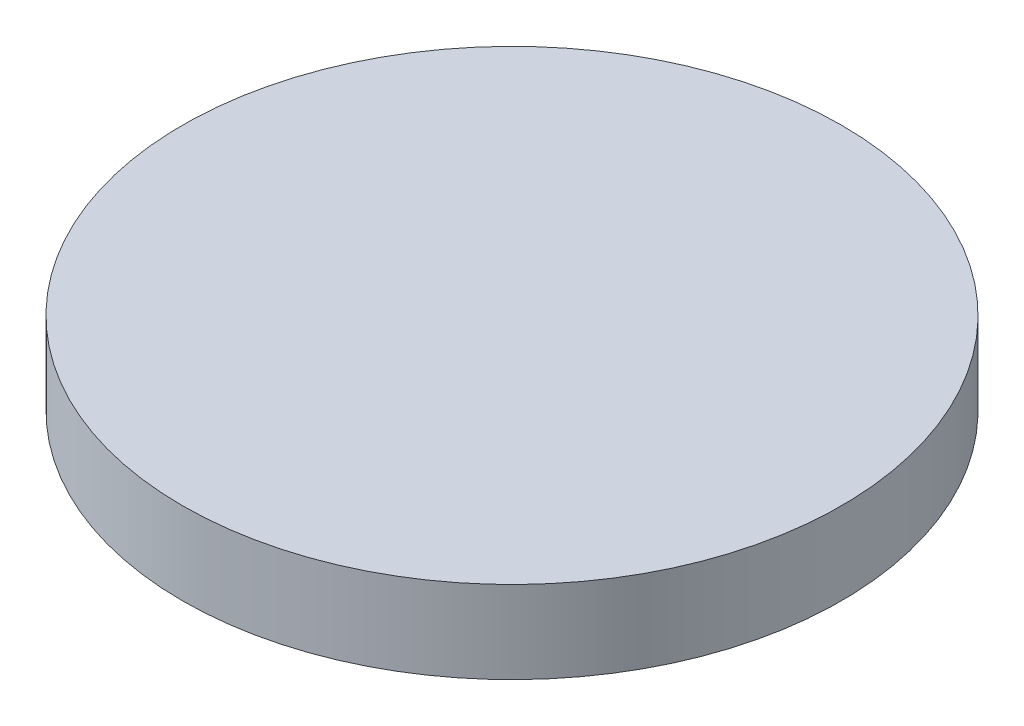
ISO-10303-21;
HEADER;
FILE_DESCRIPTION(('STEP AP214'),'2;1');
FILE_NAME('part.step','',(''),(''),'','','');
FILE_SCHEMA(('AUTOMOTIVE_DESIGN { 1 0 10303 214 1 1 1 1 }'));
ENDSEC;
DATA;
#1=APPLICATION_CONTEXT('core data for automotive mechanical design processes');
#2=APPLICATION_PROTOCOL_DEFINITION('international standard','automotive_design',2000,#1);
#3=PRODUCT_CONTEXT('',#1,'mechanical');
#4=PRODUCT('Part','Part','',(#3));
#5=PRODUCT_RELATED_PRODUCT_CATEGORY('part','',(#4));
#6=PRODUCT_DEFINITION_FORMATION('','',#4);
#7=PRODUCT_DEFINITION_CONTEXT('part definition',#1,'design');
#8=PRODUCT_DEFINITION('design','',#6,#7);
#9=PRODUCT_DEFINITION_SHAPE('','',#8);
#10=(LENGTH_UNIT() NAMED_UNIT(*) SI_UNIT(.MILLI.,.METRE.));
#11=(NAMED_UNIT(*) PLANE_ANGLE_UNIT() SI_UNIT($,.RADIAN.));
#12=(NAMED_UNIT(*) SI_UNIT($,.STERADIAN.) SOLID_ANGLE_UNIT());
#13=UNCERTAINTY_MEASURE_WITH_UNIT(LENGTH_MEASURE(1.E-05),#10,'distance_accuracy_value','');
#14=(GEOMETRIC_REPRESENTATION_CONTEXT(3) GLOBAL_UNCERTAINTY_ASSIGNED_CONTEXT((#13)) GLOBAL_UNIT_ASSIGNED_CONTEXT((#10,
#11,#12)) REPRESENTATION_CONTEXT('',''));
#15=CARTESIAN_POINT('',(0.,0.,0.));
#16=DIRECTION('',(0.,0.,1.));
#17=DIRECTION('',(1.,0.,0.));
#18=AXIS2_PLACEMENT_3D('',#15,#16,#17);
#19=CARTESIAN_POINT('',(0.,12.7,0.));
#20=DIRECTION('',(0.,-1.,0.));
#21=DIRECTION('',(0.,0.,-1.));
#22=AXIS2_PLACEMENT_3D('',#19,#20,#21);
#23=CYLINDRICAL_SURFACE('',#22,50.8);
#24=CARTESIAN_POINT('',(0.,12.7,0.));
#25=DIRECTION('',(0.,1.,0.));
#26=DIRECTION('',(0.,0.,1.));
#27=AXIS2_PLACEMENT_3D('',#24,#25,#26);
#28=CIRCLE('',#27,50.8);
#29=CARTESIAN_POINT('',(0.,12.7,50.8));
#30=VERTEX_POINT('',#29);
#31=EDGE_CURVE('E10',#30,#30,#28,.T.);
#32=ORIENTED_EDGE('',*,*,#31,.F.);
#33=EDGE_LOOP('',(#32));
#34=FACE_BOUND('',#33,.T.);
#35=CARTESIAN_POINT('',(0.,0.,0.));
#36=DIRECTION('',(0.,1.,0.));
#37=DIRECTION('',(0.,0.,1.));
#38=AXIS2_PLACEMENT_3D('',#35,#36,#37);
#39=CIRCLE('',#38,50.8);
#40=CARTESIAN_POINT('',(0.,0.,50.8));
#41=VERTEX_POINT('',#40);
#42=EDGE_CURVE('E46',#41,#41,#39,.T.);
#43=ORIENTED_EDGE('',*,*,#42,.T.);
#44=EDGE_LOOP('',(#43));
#45=FACE_BOUND('',#44,.T.);
#46=ADVANCED_FACE('F43',(#34,#45),#23,.T.);
#47=CARTESIAN_POINT('',(0.,12.7,0.));
#48=DIRECTION('',(0.,1.,0.));
#49=DIRECTION('',(0.,0.,1.));
#50=AXIS2_PLACEMENT_3D('',#47,#48,#49);
#51=PLANE('',#50);
#52=ORIENTED_EDGE('',*,*,#31,.T.);
#53=EDGE_LOOP('',(#52));
#54=FACE_BOUND('',#53,.T.);
#55=ADVANCED_FACE('F60',(#54),#51,.T.);
#56=CARTESIAN_POINT('',(0.,0.,0.));
#57=DIRECTION('',(0.,1.,0.));
#58=DIRECTION('',(0.,0.,1.));
#59=AXIS2_PLACEMENT_3D('',#56,#57,#58);
#60=PLANE('',#59);
#61=ORIENTED_EDGE('',*,*,#42,.F.);
#62=EDGE_LOOP('',(#61));
#63=FACE_BOUND('',#62,.T.);
#64=ADVANCED_FACE('F58',(#63),#60,.F.);
#65=CLOSED_SHELL('',(#46,#55,#64));
#66=MANIFOLD_SOLID_BREP('B2',#65);
#67=ADVANCED_BREP_SHAPE_REPRESENTATION('',(#18,#66),#14);
#68=SHAPE_DEFINITION_REPRESENTATION(#9,#67);
ENDSEC;
END-ISO-10303-21;
